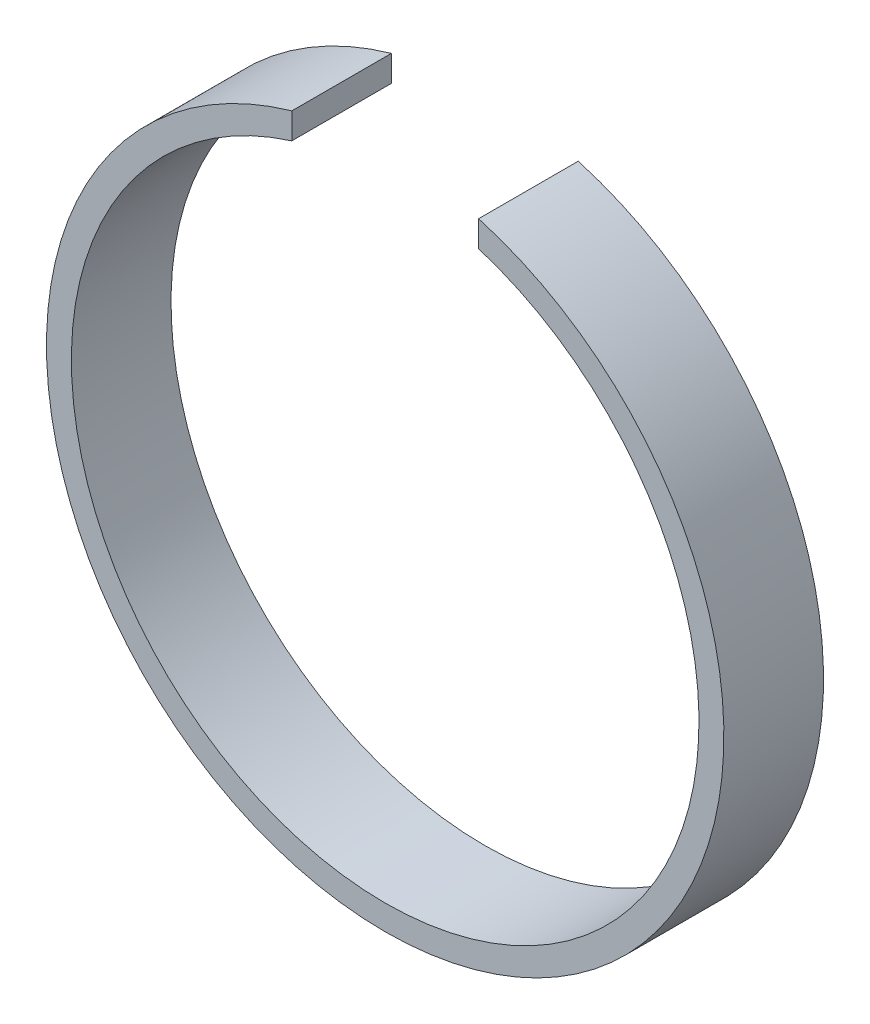
ISO-10303-21;
HEADER;
FILE_DESCRIPTION(('STEP AP214'),'2;1');
FILE_NAME('part.step','',(''),(''),'','','');
FILE_SCHEMA(('AUTOMOTIVE_DESIGN { 1 0 10303 214 1 1 1 1 }'));
ENDSEC;
DATA;
#1=APPLICATION_CONTEXT('core data for automotive mechanical design processes');
#2=APPLICATION_PROTOCOL_DEFINITION('international standard','automotive_design',2000,#1);
#3=PRODUCT_CONTEXT('',#1,'mechanical');
#4=PRODUCT('Part','Part','',(#3));
#5=PRODUCT_RELATED_PRODUCT_CATEGORY('part','',(#4));
#6=PRODUCT_DEFINITION_FORMATION('','',#4);
#7=PRODUCT_DEFINITION_CONTEXT('part definition',#1,'design');
#8=PRODUCT_DEFINITION('design','',#6,#7);
#9=PRODUCT_DEFINITION_SHAPE('','',#8);
#10=(LENGTH_UNIT() NAMED_UNIT(*) SI_UNIT(.MILLI.,.METRE.));
#11=(NAMED_UNIT(*) PLANE_ANGLE_UNIT() SI_UNIT($,.RADIAN.));
#12=(NAMED_UNIT(*) SI_UNIT($,.STERADIAN.) SOLID_ANGLE_UNIT());
#13=UNCERTAINTY_MEASURE_WITH_UNIT(LENGTH_MEASURE(1.E-05),#10,'distance_accuracy_value','');
#14=(GEOMETRIC_REPRESENTATION_CONTEXT(3) GLOBAL_UNCERTAINTY_ASSIGNED_CONTEXT((#13)) GLOBAL_UNIT_ASSIGNED_CONTEXT((#10,
#11,#12)) REPRESENTATION_CONTEXT('',''));
#15=CARTESIAN_POINT('',(0.,0.,0.));
#16=DIRECTION('',(0.,0.,1.));
#17=DIRECTION('',(1.,0.,0.));
#18=AXIS2_PLACEMENT_3D('',#15,#16,#17);
#19=CARTESIAN_POINT('',(-93.,0.,8.));
#20=DIRECTION('',(0.,0.,-1.));
#21=DIRECTION('',(-1.,0.,0.));
#22=AXIS2_PLACEMENT_3D('',#19,#20,#21);
#23=CYLINDRICAL_SURFACE('',#22,25.2);
#24=CARTESIAN_POINT('',(-93.,0.,0.));
#25=DIRECTION('',(0.,0.,-1.));
#26=DIRECTION('',(1.,0.,0.));
#27=AXIS2_PLACEMENT_3D('',#24,#25,#26);
#28=CIRCLE('',#27,25.2);
#29=CARTESIAN_POINT('',(-85.5,24.058054784209,0.));
#30=VERTEX_POINT('',#29);
#31=CARTESIAN_POINT('',(-100.5,24.058054784209,0.));
#32=VERTEX_POINT('',#31);
#33=EDGE_CURVE('E96',#30,#32,#28,.T.);
#34=ORIENTED_EDGE('',*,*,#33,.T.);
#35=DIRECTION('',(0.,0.,-1.));
#36=VECTOR('',#35,1.);
#37=CARTESIAN_POINT('',(-100.5,24.058054784209,8.));
#38=LINE('',#37,#36);
#39=CARTESIAN_POINT('',(-100.5,24.058054784209,8.));
#40=VERTEX_POINT('',#39);
#41=EDGE_CURVE('E11',#40,#32,#38,.T.);
#42=ORIENTED_EDGE('',*,*,#41,.F.);
#43=CARTESIAN_POINT('',(-93.,0.,8.));
#44=DIRECTION('',(0.,0.,-1.));
#45=DIRECTION('',(1.,0.,0.));
#46=AXIS2_PLACEMENT_3D('',#43,#44,#45);
#47=CIRCLE('',#46,25.2);
#48=CARTESIAN_POINT('',(-85.5,24.058054784209,8.));
#49=VERTEX_POINT('',#48);
#50=EDGE_CURVE('E84',#49,#40,#47,.T.);
#51=ORIENTED_EDGE('',*,*,#50,.F.);
#52=DIRECTION('',(0.,0.,-1.));
#53=VECTOR('',#52,1.);
#54=CARTESIAN_POINT('',(-85.5,24.058054784209,8.));
#55=LINE('',#54,#53);
#56=EDGE_CURVE('E92',#49,#30,#55,.T.);
#57=ORIENTED_EDGE('',*,*,#56,.T.);
#58=EDGE_LOOP('',(#34,#42,#51,#57));
#59=FACE_BOUND('',#58,.T.);
#60=ADVANCED_FACE('F33',(#59),#23,.F.);
#61=CARTESIAN_POINT('',(-100.5,26.145554115375,8.));
#62=DIRECTION('',(-1.,0.,0.));
#63=DIRECTION('',(0.,0.,1.));
#64=AXIS2_PLACEMENT_3D('',#61,#62,#63);
#65=PLANE('',#64);
#66=DIRECTION('',(0.,1.,0.));
#67=VECTOR('',#66,1.);
#68=CARTESIAN_POINT('',(-100.5,26.145554115375,0.));
#69=LINE('',#68,#67);
#70=CARTESIAN_POINT('',(-100.5,26.145554115375,0.));
#71=VERTEX_POINT('',#70);
#72=EDGE_CURVE('E88',#32,#71,#69,.T.);
#73=ORIENTED_EDGE('',*,*,#72,.T.);
#74=DIRECTION('',(0.,0.,-1.));
#75=VECTOR('',#74,1.);
#76=CARTESIAN_POINT('',(-100.5,26.145554115375,8.));
#77=LINE('',#76,#75);
#78=CARTESIAN_POINT('',(-100.5,26.145554115375,8.));
#79=VERTEX_POINT('',#78);
#80=EDGE_CURVE('E41',#79,#71,#77,.T.);
#81=ORIENTED_EDGE('',*,*,#80,.F.);
#82=DIRECTION('',(0.,1.,0.));
#83=VECTOR('',#82,1.);
#84=CARTESIAN_POINT('',(-100.5,26.145554115375,8.));
#85=LINE('',#84,#83);
#86=EDGE_CURVE('E79',#40,#79,#85,.T.);
#87=ORIENTED_EDGE('',*,*,#86,.F.);
#88=ORIENTED_EDGE('',*,*,#41,.T.);
#89=EDGE_LOOP('',(#73,#81,#87,#88));
#90=FACE_BOUND('',#89,.T.);
#91=ADVANCED_FACE('F87',(#90),#65,.F.);
#92=CARTESIAN_POINT('',(-93.,0.,8.));
#93=DIRECTION('',(0.,0.,-1.));
#94=DIRECTION('',(-1.,0.,0.));
#95=AXIS2_PLACEMENT_3D('',#92,#93,#94);
#96=CYLINDRICAL_SURFACE('',#95,27.2);
#97=CARTESIAN_POINT('',(-93.,0.,0.));
#98=DIRECTION('',(0.,0.,1.));
#99=DIRECTION('',(1.,0.,0.));
#100=AXIS2_PLACEMENT_3D('',#97,#98,#99);
#101=CIRCLE('',#100,27.2);
#102=CARTESIAN_POINT('',(-85.5,26.145554115375,0.));
#103=VERTEX_POINT('',#102);
#104=EDGE_CURVE('E66',#71,#103,#101,.T.);
#105=ORIENTED_EDGE('',*,*,#104,.T.);
#106=DIRECTION('',(0.,0.,-1.));
#107=VECTOR('',#106,1.);
#108=CARTESIAN_POINT('',(-85.5,26.145554115375,8.));
#109=LINE('',#108,#107);
#110=CARTESIAN_POINT('',(-85.5,26.145554115375,8.));
#111=VERTEX_POINT('',#110);
#112=EDGE_CURVE('E89',#111,#103,#109,.T.);
#113=ORIENTED_EDGE('',*,*,#112,.F.);
#114=CARTESIAN_POINT('',(-93.,0.,8.));
#115=DIRECTION('',(0.,0.,1.));
#116=DIRECTION('',(1.,0.,0.));
#117=AXIS2_PLACEMENT_3D('',#114,#115,#116);
#118=CIRCLE('',#117,27.2);
#119=EDGE_CURVE('E82',#79,#111,#118,.T.);
#120=ORIENTED_EDGE('',*,*,#119,.F.);
#121=ORIENTED_EDGE('',*,*,#80,.T.);
#122=EDGE_LOOP('',(#105,#113,#120,#121));
#123=FACE_BOUND('',#122,.T.);
#124=ADVANCED_FACE('F90',(#123),#96,.T.);
#125=CARTESIAN_POINT('',(-85.5,26.145554115375,8.));
#126=DIRECTION('',(1.,0.,0.));
#127=DIRECTION('',(0.,0.,-1.));
#128=AXIS2_PLACEMENT_3D('',#125,#126,#127);
#129=PLANE('',#128);
#130=DIRECTION('',(0.,-1.,0.));
#131=VECTOR('',#130,1.);
#132=CARTESIAN_POINT('',(-85.5,26.145554115375,0.));
#133=LINE('',#132,#131);
#134=EDGE_CURVE('E72',#103,#30,#133,.T.);
#135=ORIENTED_EDGE('',*,*,#134,.T.);
#136=ORIENTED_EDGE('',*,*,#56,.F.);
#137=DIRECTION('',(0.,-1.,0.));
#138=VECTOR('',#137,1.);
#139=CARTESIAN_POINT('',(-85.5,26.145554115375,8.));
#140=LINE('',#139,#138);
#141=EDGE_CURVE('E49',#111,#49,#140,.T.);
#142=ORIENTED_EDGE('',*,*,#141,.F.);
#143=ORIENTED_EDGE('',*,*,#112,.T.);
#144=EDGE_LOOP('',(#135,#136,#142,#143));
#145=FACE_BOUND('',#144,.T.);
#146=ADVANCED_FACE('F103',(#145),#129,.F.);
#147=CARTESIAN_POINT('',(-93.,0.,8.));
#148=DIRECTION('',(0.,0.,1.));
#149=DIRECTION('',(1.,0.,0.));
#150=AXIS2_PLACEMENT_3D('',#147,#148,#149);
#151=PLANE('',#150);
#152=ORIENTED_EDGE('',*,*,#50,.T.);
#153=ORIENTED_EDGE('',*,*,#86,.T.);
#154=ORIENTED_EDGE('',*,*,#119,.T.);
#155=ORIENTED_EDGE('',*,*,#141,.T.);
#156=EDGE_LOOP('',(#152,#153,#154,#155));
#157=FACE_BOUND('',#156,.T.);
#158=ADVANCED_FACE('F80',(#157),#151,.T.);
#159=CARTESIAN_POINT('',(-93.,0.,0.));
#160=DIRECTION('',(0.,0.,1.));
#161=DIRECTION('',(1.,0.,0.));
#162=AXIS2_PLACEMENT_3D('',#159,#160,#161);
#163=PLANE('',#162);
#164=ORIENTED_EDGE('',*,*,#33,.F.);
#165=ORIENTED_EDGE('',*,*,#134,.F.);
#166=ORIENTED_EDGE('',*,*,#104,.F.);
#167=ORIENTED_EDGE('',*,*,#72,.F.);
#168=EDGE_LOOP('',(#164,#165,#166,#167));
#169=FACE_BOUND('',#168,.T.);
#170=ADVANCED_FACE('F106',(#169),#163,.F.);
#171=CLOSED_SHELL('',(#60,#91,#124,#146,#158,#170));
#172=MANIFOLD_SOLID_BREP('B2',#171);
#173=ADVANCED_BREP_SHAPE_REPRESENTATION('',(#18,#172),#14);
#174=SHAPE_DEFINITION_REPRESENTATION(#9,#173);
ENDSEC;
END-ISO-10303-21;
